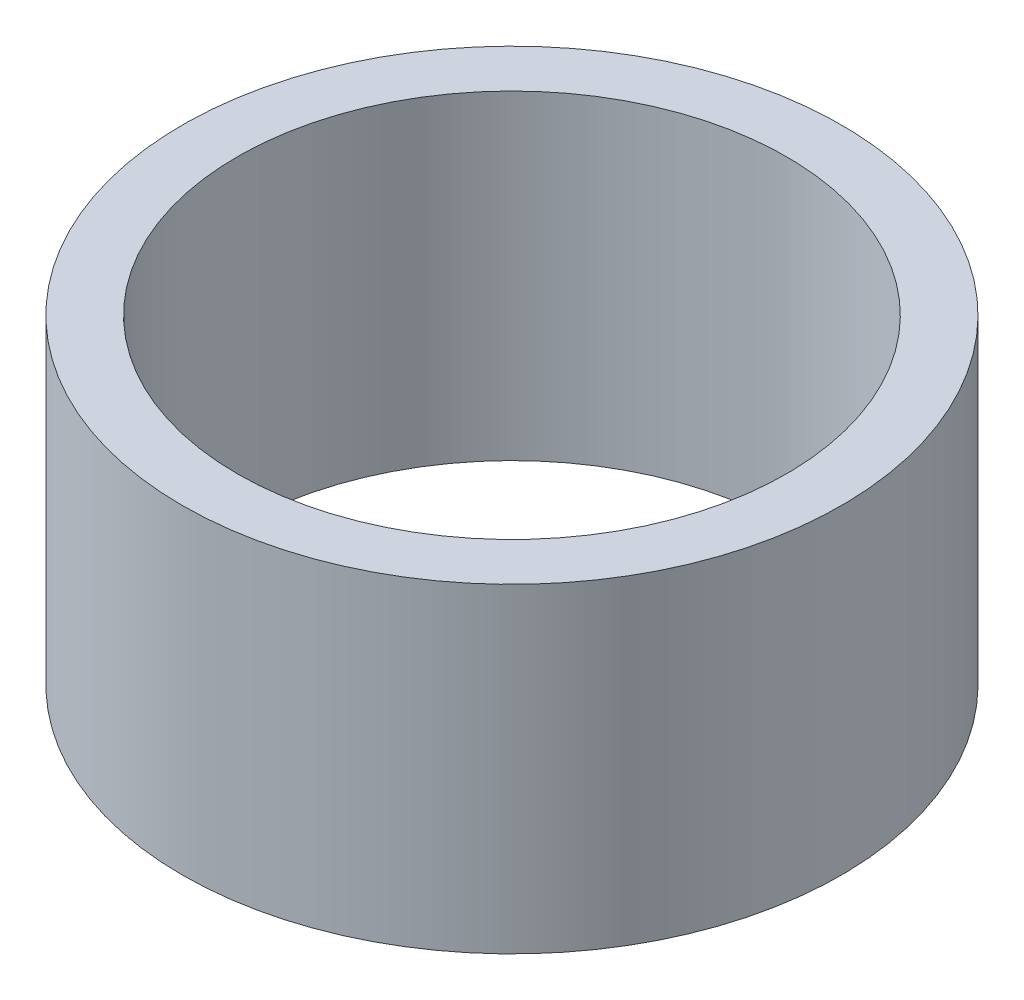
ISO-10303-21;
HEADER;
FILE_DESCRIPTION(('STEP AP214'),'2;1');
FILE_NAME('part.step','',(''),(''),'','','');
FILE_SCHEMA(('AUTOMOTIVE_DESIGN { 1 0 10303 214 1 1 1 1 }'));
ENDSEC;
DATA;
#1=APPLICATION_CONTEXT('core data for automotive mechanical design processes');
#2=APPLICATION_PROTOCOL_DEFINITION('international standard','automotive_design',2000,#1);
#3=PRODUCT_CONTEXT('',#1,'mechanical');
#4=PRODUCT('Part','Part','',(#3));
#5=PRODUCT_RELATED_PRODUCT_CATEGORY('part','',(#4));
#6=PRODUCT_DEFINITION_FORMATION('','',#4);
#7=PRODUCT_DEFINITION_CONTEXT('part definition',#1,'design');
#8=PRODUCT_DEFINITION('design','',#6,#7);
#9=PRODUCT_DEFINITION_SHAPE('','',#8);
#10=(LENGTH_UNIT() NAMED_UNIT(*) SI_UNIT(.MILLI.,.METRE.));
#11=(NAMED_UNIT(*) PLANE_ANGLE_UNIT() SI_UNIT($,.RADIAN.));
#12=(NAMED_UNIT(*) SI_UNIT($,.STERADIAN.) SOLID_ANGLE_UNIT());
#13=UNCERTAINTY_MEASURE_WITH_UNIT(LENGTH_MEASURE(1.E-05),#10,'distance_accuracy_value','');
#14=(GEOMETRIC_REPRESENTATION_CONTEXT(3) GLOBAL_UNCERTAINTY_ASSIGNED_CONTEXT((#13)) GLOBAL_UNIT_ASSIGNED_CONTEXT((#10,
#11,#12)) REPRESENTATION_CONTEXT('',''));
#15=CARTESIAN_POINT('',(0.,0.,0.));
#16=DIRECTION('',(0.,0.,1.));
#17=DIRECTION('',(1.,0.,0.));
#18=AXIS2_PLACEMENT_3D('',#15,#16,#17);
#19=CARTESIAN_POINT('',(0.,9.25,0.));
#20=DIRECTION('',(0.,1.,0.));
#21=DIRECTION('',(0.,0.,1.));
#22=AXIS2_PLACEMENT_3D('',#19,#20,#21);
#23=PLANE('',#22);
#24=CARTESIAN_POINT('',(0.,9.25,0.));
#25=DIRECTION('',(0.,1.,0.));
#26=DIRECTION('',(0.,0.,1.));
#27=AXIS2_PLACEMENT_3D('',#24,#25,#26);
#28=CIRCLE('',#27,9.525);
#29=CARTESIAN_POINT('',(0.,9.25,9.525));
#30=VERTEX_POINT('',#29);
#31=EDGE_CURVE('E10',#30,#30,#28,.T.);
#32=ORIENTED_EDGE('',*,*,#31,.T.);
#33=EDGE_LOOP('',(#32));
#34=FACE_BOUND('',#33,.T.);
#35=CARTESIAN_POINT('',(0.,9.25,0.));
#36=DIRECTION('',(0.,1.,0.));
#37=DIRECTION('',(0.,0.,1.));
#38=AXIS2_PLACEMENT_3D('',#35,#36,#37);
#39=CIRCLE('',#38,7.9375);
#40=CARTESIAN_POINT('',(0.,9.25,7.9375));
#41=VERTEX_POINT('',#40);
#42=EDGE_CURVE('E44',#41,#41,#39,.T.);
#43=ORIENTED_EDGE('',*,*,#42,.F.);
#44=EDGE_LOOP('',(#43));
#45=FACE_BOUND('',#44,.T.);
#46=ADVANCED_FACE('F33',(#34,#45),#23,.T.);
#47=CARTESIAN_POINT('',(0.,0.,0.));
#48=DIRECTION('',(0.,1.,0.));
#49=DIRECTION('',(0.,0.,1.));
#50=AXIS2_PLACEMENT_3D('',#47,#48,#49);
#51=PLANE('',#50);
#52=CARTESIAN_POINT('',(0.,0.,0.));
#53=DIRECTION('',(0.,1.,0.));
#54=DIRECTION('',(0.,0.,1.));
#55=AXIS2_PLACEMENT_3D('',#52,#53,#54);
#56=CIRCLE('',#55,9.525);
#57=CARTESIAN_POINT('',(0.,0.,9.525));
#58=VERTEX_POINT('',#57);
#59=EDGE_CURVE('E37',#58,#58,#56,.T.);
#60=ORIENTED_EDGE('',*,*,#59,.F.);
#61=EDGE_LOOP('',(#60));
#62=FACE_BOUND('',#61,.T.);
#63=CARTESIAN_POINT('',(0.,0.,0.));
#64=DIRECTION('',(0.,1.,0.));
#65=DIRECTION('',(0.,0.,1.));
#66=AXIS2_PLACEMENT_3D('',#63,#64,#65);
#67=CIRCLE('',#66,7.9375);
#68=CARTESIAN_POINT('',(0.,0.,7.9375));
#69=VERTEX_POINT('',#68);
#70=EDGE_CURVE('E46',#69,#69,#67,.T.);
#71=ORIENTED_EDGE('',*,*,#70,.T.);
#72=EDGE_LOOP('',(#71));
#73=FACE_BOUND('',#72,.T.);
#74=ADVANCED_FACE('F56',(#62,#73),#51,.F.);
#75=CARTESIAN_POINT('',(0.,9.25,0.));
#76=DIRECTION('',(0.,-1.,0.));
#77=DIRECTION('',(0.,0.,-1.));
#78=AXIS2_PLACEMENT_3D('',#75,#76,#77);
#79=CYLINDRICAL_SURFACE('',#78,9.525);
#80=ORIENTED_EDGE('',*,*,#31,.F.);
#81=EDGE_LOOP('',(#80));
#82=FACE_BOUND('',#81,.T.);
#83=ORIENTED_EDGE('',*,*,#59,.T.);
#84=EDGE_LOOP('',(#83));
#85=FACE_BOUND('',#84,.T.);
#86=ADVANCED_FACE('F35',(#82,#85),#79,.T.);
#87=CARTESIAN_POINT('',(0.,9.25,0.));
#88=DIRECTION('',(0.,-1.,0.));
#89=DIRECTION('',(0.,0.,-1.));
#90=AXIS2_PLACEMENT_3D('',#87,#88,#89);
#91=CYLINDRICAL_SURFACE('',#90,7.9375);
#92=ORIENTED_EDGE('',*,*,#42,.T.);
#93=EDGE_LOOP('',(#92));
#94=FACE_BOUND('',#93,.T.);
#95=ORIENTED_EDGE('',*,*,#70,.F.);
#96=EDGE_LOOP('',(#95));
#97=FACE_BOUND('',#96,.T.);
#98=ADVANCED_FACE('F52',(#94,#97),#91,.F.);
#99=CLOSED_SHELL('',(#46,#74,#86,#98));
#100=MANIFOLD_SOLID_BREP('B2',#99);
#101=ADVANCED_BREP_SHAPE_REPRESENTATION('',(#18,#100),#14);
#102=SHAPE_DEFINITION_REPRESENTATION(#9,#101);
ENDSEC;
END-ISO-10303-21;
